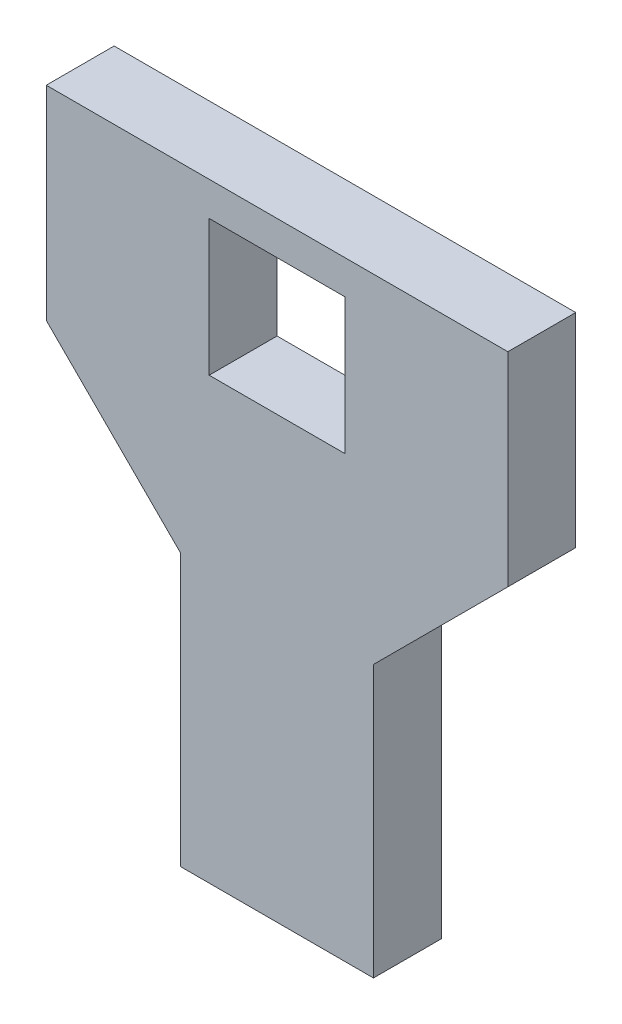
ISO-10303-21;
HEADER;
FILE_DESCRIPTION(('STEP AP214'),'2;1');
FILE_NAME('part.step','',(''),(''),'','','');
FILE_SCHEMA(('AUTOMOTIVE_DESIGN { 1 0 10303 214 1 1 1 1 }'));
ENDSEC;
DATA;
#1=APPLICATION_CONTEXT('core data for automotive mechanical design processes');
#2=APPLICATION_PROTOCOL_DEFINITION('international standard','automotive_design',2000,#1);
#3=PRODUCT_CONTEXT('',#1,'mechanical');
#4=PRODUCT('Part','Part','',(#3));
#5=PRODUCT_RELATED_PRODUCT_CATEGORY('part','',(#4));
#6=PRODUCT_DEFINITION_FORMATION('','',#4);
#7=PRODUCT_DEFINITION_CONTEXT('part definition',#1,'design');
#8=PRODUCT_DEFINITION('design','',#6,#7);
#9=PRODUCT_DEFINITION_SHAPE('','',#8);
#10=(LENGTH_UNIT() NAMED_UNIT(*) SI_UNIT(.MILLI.,.METRE.));
#11=(NAMED_UNIT(*) PLANE_ANGLE_UNIT() SI_UNIT($,.RADIAN.));
#12=(NAMED_UNIT(*) SI_UNIT($,.STERADIAN.) SOLID_ANGLE_UNIT());
#13=UNCERTAINTY_MEASURE_WITH_UNIT(LENGTH_MEASURE(1.E-05),#10,'distance_accuracy_value','');
#14=(GEOMETRIC_REPRESENTATION_CONTEXT(3) GLOBAL_UNCERTAINTY_ASSIGNED_CONTEXT((#13)) GLOBAL_UNIT_ASSIGNED_CONTEXT((#10,
#11,#12)) REPRESENTATION_CONTEXT('',''));
#15=CARTESIAN_POINT('',(0.,0.,0.));
#16=DIRECTION('',(0.,0.,1.));
#17=DIRECTION('',(1.,0.,0.));
#18=AXIS2_PLACEMENT_3D('',#15,#16,#17);
#19=CARTESIAN_POINT('',(0.,5.,5.));
#20=DIRECTION('',(0.,1.,0.));
#21=DIRECTION('',(-1.,0.,0.));
#22=AXIS2_PLACEMENT_3D('',#19,#20,#21);
#23=PLANE('',#22);
#24=DIRECTION('',(1.,0.,0.));
#25=VECTOR('',#24,1.);
#26=CARTESIAN_POINT('',(0.,5.,0.));
#27=LINE('',#26,#25);
#28=CARTESIAN_POINT('',(-5.,5.,0.));
#29=VERTEX_POINT('',#28);
#30=CARTESIAN_POINT('',(5.,5.,0.));
#31=VERTEX_POINT('',#30);
#32=EDGE_CURVE('E195',#29,#31,#27,.T.);
#33=ORIENTED_EDGE('',*,*,#32,.T.);
#34=DIRECTION('',(0.,0.,-1.));
#35=VECTOR('',#34,1.);
#36=CARTESIAN_POINT('',(5.,5.,5.));
#37=LINE('',#36,#35);
#38=CARTESIAN_POINT('',(5.,5.,5.));
#39=VERTEX_POINT('',#38);
#40=EDGE_CURVE('E11',#39,#31,#37,.T.);
#41=ORIENTED_EDGE('',*,*,#40,.F.);
#42=DIRECTION('',(1.,0.,0.));
#43=VECTOR('',#42,1.);
#44=CARTESIAN_POINT('',(0.,5.,5.));
#45=LINE('',#44,#43);
#46=CARTESIAN_POINT('',(-5.,5.,5.));
#47=VERTEX_POINT('',#46);
#48=EDGE_CURVE('E145',#47,#39,#45,.T.);
#49=ORIENTED_EDGE('',*,*,#48,.F.);
#50=DIRECTION('',(0.,0.,-1.));
#51=VECTOR('',#50,1.);
#52=CARTESIAN_POINT('',(-5.,5.,5.));
#53=LINE('',#52,#51);
#54=EDGE_CURVE('E61',#47,#29,#53,.T.);
#55=ORIENTED_EDGE('',*,*,#54,.T.);
#56=EDGE_LOOP('',(#33,#41,#49,#55));
#57=FACE_BOUND('',#56,.T.);
#58=ADVANCED_FACE('F41',(#57),#23,.F.);
#59=CARTESIAN_POINT('',(5.,0.,5.));
#60=DIRECTION('',(1.,0.,0.));
#61=DIRECTION('',(0.,1.,0.));
#62=AXIS2_PLACEMENT_3D('',#59,#60,#61);
#63=PLANE('',#62);
#64=DIRECTION('',(0.,-1.,0.));
#65=VECTOR('',#64,1.);
#66=CARTESIAN_POINT('',(5.,0.,0.));
#67=LINE('',#66,#65);
#68=CARTESIAN_POINT('',(5.,-5.,0.));
#69=VERTEX_POINT('',#68);
#70=EDGE_CURVE('E152',#31,#69,#67,.T.);
#71=ORIENTED_EDGE('',*,*,#70,.T.);
#72=DIRECTION('',(0.,0.,-1.));
#73=VECTOR('',#72,1.);
#74=CARTESIAN_POINT('',(5.,-5.,5.));
#75=LINE('',#74,#73);
#76=CARTESIAN_POINT('',(5.,-5.,5.));
#77=VERTEX_POINT('',#76);
#78=EDGE_CURVE('E52',#77,#69,#75,.T.);
#79=ORIENTED_EDGE('',*,*,#78,.F.);
#80=DIRECTION('',(0.,-1.,0.));
#81=VECTOR('',#80,1.);
#82=CARTESIAN_POINT('',(5.,0.,5.));
#83=LINE('',#82,#81);
#84=EDGE_CURVE('E139',#39,#77,#83,.T.);
#85=ORIENTED_EDGE('',*,*,#84,.F.);
#86=ORIENTED_EDGE('',*,*,#40,.T.);
#87=EDGE_LOOP('',(#71,#79,#85,#86));
#88=FACE_BOUND('',#87,.T.);
#89=ADVANCED_FACE('F151',(#88),#63,.F.);
#90=CARTESIAN_POINT('',(0.,-5.,5.));
#91=DIRECTION('',(0.,1.,0.));
#92=DIRECTION('',(0.,0.,1.));
#93=AXIS2_PLACEMENT_3D('',#90,#91,#92);
#94=PLANE('',#93);
#95=DIRECTION('',(1.,0.,0.));
#96=VECTOR('',#95,1.);
#97=CARTESIAN_POINT('',(0.,-5.,0.));
#98=LINE('',#97,#96);
#99=CARTESIAN_POINT('',(-5.,-5.,0.));
#100=VERTEX_POINT('',#99);
#101=EDGE_CURVE('E200',#100,#69,#98,.T.);
#102=ORIENTED_EDGE('',*,*,#101,.F.);
#103=DIRECTION('',(0.,0.,-1.));
#104=VECTOR('',#103,1.);
#105=CARTESIAN_POINT('',(-5.,-5.,5.));
#106=LINE('',#105,#104);
#107=CARTESIAN_POINT('',(-5.,-5.,5.));
#108=VERTEX_POINT('',#107);
#109=EDGE_CURVE('E99',#108,#100,#106,.T.);
#110=ORIENTED_EDGE('',*,*,#109,.F.);
#111=DIRECTION('',(1.,0.,0.));
#112=VECTOR('',#111,1.);
#113=CARTESIAN_POINT('',(0.,-5.,5.));
#114=LINE('',#113,#112);
#115=EDGE_CURVE('E144',#108,#77,#114,.T.);
#116=ORIENTED_EDGE('',*,*,#115,.T.);
#117=ORIENTED_EDGE('',*,*,#78,.T.);
#118=EDGE_LOOP('',(#102,#110,#116,#117));
#119=FACE_BOUND('',#118,.T.);
#120=ADVANCED_FACE('F157',(#119),#94,.T.);
#121=CARTESIAN_POINT('',(17.,0.,5.));
#122=DIRECTION('',(1.,0.,0.));
#123=DIRECTION('',(0.,0.,-1.));
#124=AXIS2_PLACEMENT_3D('',#121,#122,#123);
#125=PLANE('',#124);
#126=DIRECTION('',(0.,-1.,0.));
#127=VECTOR('',#126,1.);
#128=CARTESIAN_POINT('',(17.,0.,0.));
#129=LINE('',#128,#127);
#130=CARTESIAN_POINT('',(17.,7.5,0.));
#131=VERTEX_POINT('',#130);
#132=CARTESIAN_POINT('',(17.,-7.5,0.));
#133=VERTEX_POINT('',#132);
#134=EDGE_CURVE('E166',#131,#133,#129,.T.);
#135=ORIENTED_EDGE('',*,*,#134,.F.);
#136=DIRECTION('',(0.,0.,-1.));
#137=VECTOR('',#136,1.);
#138=CARTESIAN_POINT('',(17.,7.5,5.));
#139=LINE('',#138,#137);
#140=CARTESIAN_POINT('',(17.,7.5,5.));
#141=VERTEX_POINT('',#140);
#142=EDGE_CURVE('E45',#141,#131,#139,.T.);
#143=ORIENTED_EDGE('',*,*,#142,.F.);
#144=DIRECTION('',(0.,-1.,0.));
#145=VECTOR('',#144,1.);
#146=CARTESIAN_POINT('',(17.,0.,5.));
#147=LINE('',#146,#145);
#148=CARTESIAN_POINT('',(17.,-7.5,5.));
#149=VERTEX_POINT('',#148);
#150=EDGE_CURVE('E207',#141,#149,#147,.T.);
#151=ORIENTED_EDGE('',*,*,#150,.T.);
#152=DIRECTION('',(0.,0.,-1.));
#153=VECTOR('',#152,1.);
#154=CARTESIAN_POINT('',(17.,-7.5,5.));
#155=LINE('',#154,#153);
#156=EDGE_CURVE('E162',#149,#133,#155,.T.);
#157=ORIENTED_EDGE('',*,*,#156,.T.);
#158=EDGE_LOOP('',(#135,#143,#151,#157));
#159=FACE_BOUND('',#158,.T.);
#160=ADVANCED_FACE('F43',(#159),#125,.T.);
#161=CARTESIAN_POINT('',(0.,7.5,5.));
#162=DIRECTION('',(0.,1.,0.));
#163=DIRECTION('',(0.,0.,1.));
#164=AXIS2_PLACEMENT_3D('',#161,#162,#163);
#165=PLANE('',#164);
#166=DIRECTION('',(1.,0.,0.));
#167=VECTOR('',#166,1.);
#168=CARTESIAN_POINT('',(0.,7.5,0.));
#169=LINE('',#168,#167);
#170=CARTESIAN_POINT('',(-17.,7.5,0.));
#171=VERTEX_POINT('',#170);
#172=EDGE_CURVE('E170',#171,#131,#169,.T.);
#173=ORIENTED_EDGE('',*,*,#172,.F.);
#174=DIRECTION('',(0.,0.,-1.));
#175=VECTOR('',#174,1.);
#176=CARTESIAN_POINT('',(-17.,7.5,5.));
#177=LINE('',#176,#175);
#178=CARTESIAN_POINT('',(-17.,7.5,5.));
#179=VERTEX_POINT('',#178);
#180=EDGE_CURVE('E231',#179,#171,#177,.T.);
#181=ORIENTED_EDGE('',*,*,#180,.F.);
#182=DIRECTION('',(1.,0.,0.));
#183=VECTOR('',#182,1.);
#184=CARTESIAN_POINT('',(0.,7.5,5.));
#185=LINE('',#184,#183);
#186=EDGE_CURVE('E242',#179,#141,#185,.T.);
#187=ORIENTED_EDGE('',*,*,#186,.T.);
#188=ORIENTED_EDGE('',*,*,#142,.T.);
#189=EDGE_LOOP('',(#173,#181,#187,#188));
#190=FACE_BOUND('',#189,.T.);
#191=ADVANCED_FACE('F240',(#190),#165,.T.);
#192=CARTESIAN_POINT('',(-17.,0.,5.));
#193=DIRECTION('',(1.,0.,0.));
#194=DIRECTION('',(0.,0.,-1.));
#195=AXIS2_PLACEMENT_3D('',#192,#193,#194);
#196=PLANE('',#195);
#197=DIRECTION('',(0.,-1.,0.));
#198=VECTOR('',#197,1.);
#199=CARTESIAN_POINT('',(-17.,0.,0.));
#200=LINE('',#199,#198);
#201=CARTESIAN_POINT('',(-17.,-7.5,0.));
#202=VERTEX_POINT('',#201);
#203=EDGE_CURVE('E174',#171,#202,#200,.T.);
#204=ORIENTED_EDGE('',*,*,#203,.T.);
#205=DIRECTION('',(0.,0.,-1.));
#206=VECTOR('',#205,1.);
#207=CARTESIAN_POINT('',(-17.,-7.5,5.));
#208=LINE('',#207,#206);
#209=CARTESIAN_POINT('',(-17.,-7.5,5.));
#210=VERTEX_POINT('',#209);
#211=EDGE_CURVE('E228',#210,#202,#208,.T.);
#212=ORIENTED_EDGE('',*,*,#211,.F.);
#213=DIRECTION('',(0.,-1.,0.));
#214=VECTOR('',#213,1.);
#215=CARTESIAN_POINT('',(-17.,0.,5.));
#216=LINE('',#215,#214);
#217=EDGE_CURVE('E260',#179,#210,#216,.T.);
#218=ORIENTED_EDGE('',*,*,#217,.F.);
#219=ORIENTED_EDGE('',*,*,#180,.T.);
#220=EDGE_LOOP('',(#204,#212,#218,#219));
#221=FACE_BOUND('',#220,.T.);
#222=ADVANCED_FACE('F250',(#221),#196,.F.);
#223=CARTESIAN_POINT('',(-12.25,-12.25,5.));
#224=DIRECTION('',(0.707106781186548,0.707106781186547,0.));
#225=DIRECTION('',(-0.707106781186547,0.707106781186548,0.));
#226=AXIS2_PLACEMENT_3D('',#223,#224,#225);
#227=PLANE('',#226);
#228=DIRECTION('',(0.707106781186547,-0.707106781186548,0.));
#229=VECTOR('',#228,1.);
#230=CARTESIAN_POINT('',(-12.25,-12.25,0.));
#231=LINE('',#230,#229);
#232=CARTESIAN_POINT('',(-7.10050506338835,-17.3994949366117,0.));
#233=VERTEX_POINT('',#232);
#234=EDGE_CURVE('E177',#202,#233,#231,.T.);
#235=ORIENTED_EDGE('',*,*,#234,.T.);
#236=DIRECTION('',(0.,0.,-1.));
#237=VECTOR('',#236,1.);
#238=CARTESIAN_POINT('',(-7.10050506338835,-17.3994949366117,5.));
#239=LINE('',#238,#237);
#240=CARTESIAN_POINT('',(-7.10050506338835,-17.3994949366117,5.));
#241=VERTEX_POINT('',#240);
#242=EDGE_CURVE('E224',#241,#233,#239,.T.);
#243=ORIENTED_EDGE('',*,*,#242,.F.);
#244=DIRECTION('',(0.707106781186547,-0.707106781186548,0.));
#245=VECTOR('',#244,1.);
#246=CARTESIAN_POINT('',(-12.25,-12.25,5.));
#247=LINE('',#246,#245);
#248=EDGE_CURVE('E255',#210,#241,#247,.T.);
#249=ORIENTED_EDGE('',*,*,#248,.F.);
#250=ORIENTED_EDGE('',*,*,#211,.T.);
#251=EDGE_LOOP('',(#235,#243,#249,#250));
#252=FACE_BOUND('',#251,.T.);
#253=ADVANCED_FACE('F253',(#252),#227,.F.);
#254=CARTESIAN_POINT('',(-7.10050506338835,0.,5.));
#255=DIRECTION('',(1.,0.,0.));
#256=DIRECTION('',(0.,1.,0.));
#257=AXIS2_PLACEMENT_3D('',#254,#255,#256);
#258=PLANE('',#257);
#259=DIRECTION('',(0.,-1.,0.));
#260=VECTOR('',#259,1.);
#261=CARTESIAN_POINT('',(-7.10050506338835,0.,0.));
#262=LINE('',#261,#260);
#263=CARTESIAN_POINT('',(-7.10050506338835,-37.3994949366117,0.));
#264=VERTEX_POINT('',#263);
#265=EDGE_CURVE('E180',#233,#264,#262,.T.);
#266=ORIENTED_EDGE('',*,*,#265,.T.);
#267=DIRECTION('',(0.,0.,-1.));
#268=VECTOR('',#267,1.);
#269=CARTESIAN_POINT('',(-7.10050506338835,-37.3994949366117,5.));
#270=LINE('',#269,#268);
#271=CARTESIAN_POINT('',(-7.10050506338835,-37.3994949366117,5.));
#272=VERTEX_POINT('',#271);
#273=EDGE_CURVE('E220',#272,#264,#270,.T.);
#274=ORIENTED_EDGE('',*,*,#273,.F.);
#275=DIRECTION('',(0.,-1.,0.));
#276=VECTOR('',#275,1.);
#277=CARTESIAN_POINT('',(-7.10050506338835,0.,5.));
#278=LINE('',#277,#276);
#279=EDGE_CURVE('E259',#241,#272,#278,.T.);
#280=ORIENTED_EDGE('',*,*,#279,.F.);
#281=ORIENTED_EDGE('',*,*,#242,.T.);
#282=EDGE_LOOP('',(#266,#274,#280,#281));
#283=FACE_BOUND('',#282,.T.);
#284=ADVANCED_FACE('F293',(#283),#258,.F.);
#285=CARTESIAN_POINT('',(0.,-37.3994949366117,5.));
#286=DIRECTION('',(0.,1.,0.));
#287=DIRECTION('',(0.,0.,1.));
#288=AXIS2_PLACEMENT_3D('',#285,#286,#287);
#289=PLANE('',#288);
#290=DIRECTION('',(1.,0.,0.));
#291=VECTOR('',#290,1.);
#292=CARTESIAN_POINT('',(0.,-37.3994949366117,0.));
#293=LINE('',#292,#291);
#294=CARTESIAN_POINT('',(7.10050506338835,-37.3994949366117,0.));
#295=VERTEX_POINT('',#294);
#296=EDGE_CURVE('E183',#264,#295,#293,.T.);
#297=ORIENTED_EDGE('',*,*,#296,.T.);
#298=DIRECTION('',(0.,0.,-1.));
#299=VECTOR('',#298,1.);
#300=CARTESIAN_POINT('',(7.10050506338835,-37.3994949366117,5.));
#301=LINE('',#300,#299);
#302=CARTESIAN_POINT('',(7.10050506338835,-37.3994949366117,5.));
#303=VERTEX_POINT('',#302);
#304=EDGE_CURVE('E217',#303,#295,#301,.T.);
#305=ORIENTED_EDGE('',*,*,#304,.F.);
#306=DIRECTION('',(1.,0.,0.));
#307=VECTOR('',#306,1.);
#308=CARTESIAN_POINT('',(0.,-37.3994949366117,5.));
#309=LINE('',#308,#307);
#310=EDGE_CURVE('E264',#272,#303,#309,.T.);
#311=ORIENTED_EDGE('',*,*,#310,.F.);
#312=ORIENTED_EDGE('',*,*,#273,.T.);
#313=EDGE_LOOP('',(#297,#305,#311,#312));
#314=FACE_BOUND('',#313,.T.);
#315=ADVANCED_FACE('F290',(#314),#289,.F.);
#316=CARTESIAN_POINT('',(7.10050506338835,0.,5.));
#317=DIRECTION('',(1.,0.,0.));
#318=DIRECTION('',(0.,1.,0.));
#319=AXIS2_PLACEMENT_3D('',#316,#317,#318);
#320=PLANE('',#319);
#321=DIRECTION('',(0.,-1.,0.));
#322=VECTOR('',#321,1.);
#323=CARTESIAN_POINT('',(7.10050506338835,0.,0.));
#324=LINE('',#323,#322);
#325=CARTESIAN_POINT('',(7.10050506338835,-17.3994949366117,0.));
#326=VERTEX_POINT('',#325);
#327=EDGE_CURVE('E187',#326,#295,#324,.T.);
#328=ORIENTED_EDGE('',*,*,#327,.F.);
#329=DIRECTION('',(0.,0.,-1.));
#330=VECTOR('',#329,1.);
#331=CARTESIAN_POINT('',(7.10050506338835,-17.3994949366117,5.));
#332=LINE('',#331,#330);
#333=CARTESIAN_POINT('',(7.10050506338835,-17.3994949366117,5.));
#334=VERTEX_POINT('',#333);
#335=EDGE_CURVE('E214',#334,#326,#332,.T.);
#336=ORIENTED_EDGE('',*,*,#335,.F.);
#337=DIRECTION('',(0.,-1.,0.));
#338=VECTOR('',#337,1.);
#339=CARTESIAN_POINT('',(7.10050506338835,0.,5.));
#340=LINE('',#339,#338);
#341=EDGE_CURVE('E271',#334,#303,#340,.T.);
#342=ORIENTED_EDGE('',*,*,#341,.T.);
#343=ORIENTED_EDGE('',*,*,#304,.T.);
#344=EDGE_LOOP('',(#328,#336,#342,#343));
#345=FACE_BOUND('',#344,.T.);
#346=ADVANCED_FACE('F287',(#345),#320,.T.);
#347=CARTESIAN_POINT('',(12.25,-12.25,5.));
#348=DIRECTION('',(0.707106781186548,-0.707106781186547,0.));
#349=DIRECTION('',(0.707106781186547,0.707106781186548,0.));
#350=AXIS2_PLACEMENT_3D('',#347,#348,#349);
#351=PLANE('',#350);
#352=DIRECTION('',(-0.707106781186547,-0.707106781186548,0.));
#353=VECTOR('',#352,1.);
#354=CARTESIAN_POINT('',(12.25,-12.25,0.));
#355=LINE('',#354,#353);
#356=EDGE_CURVE('E191',#133,#326,#355,.T.);
#357=ORIENTED_EDGE('',*,*,#356,.F.);
#358=ORIENTED_EDGE('',*,*,#156,.F.);
#359=DIRECTION('',(-0.707106781186547,-0.707106781186548,0.));
#360=VECTOR('',#359,1.);
#361=CARTESIAN_POINT('',(12.25,-12.25,5.));
#362=LINE('',#361,#360);
#363=EDGE_CURVE('E275',#149,#334,#362,.T.);
#364=ORIENTED_EDGE('',*,*,#363,.T.);
#365=ORIENTED_EDGE('',*,*,#335,.T.);
#366=EDGE_LOOP('',(#357,#358,#364,#365));
#367=FACE_BOUND('',#366,.T.);
#368=ADVANCED_FACE('F281',(#367),#351,.T.);
#369=CARTESIAN_POINT('',(-5.,0.,5.));
#370=DIRECTION('',(1.,0.,0.));
#371=DIRECTION('',(0.,0.,-1.));
#372=AXIS2_PLACEMENT_3D('',#369,#370,#371);
#373=PLANE('',#372);
#374=DIRECTION('',(0.,-1.,0.));
#375=VECTOR('',#374,1.);
#376=CARTESIAN_POINT('',(-5.,0.,0.));
#377=LINE('',#376,#375);
#378=EDGE_CURVE('E203',#29,#100,#377,.T.);
#379=ORIENTED_EDGE('',*,*,#378,.F.);
#380=ORIENTED_EDGE('',*,*,#54,.F.);
#381=DIRECTION('',(0.,-1.,0.));
#382=VECTOR('',#381,1.);
#383=CARTESIAN_POINT('',(-5.,0.,5.));
#384=LINE('',#383,#382);
#385=EDGE_CURVE('E159',#47,#108,#384,.T.);
#386=ORIENTED_EDGE('',*,*,#385,.T.);
#387=ORIENTED_EDGE('',*,*,#109,.T.);
#388=EDGE_LOOP('',(#379,#380,#386,#387));
#389=FACE_BOUND('',#388,.T.);
#390=ADVANCED_FACE('F312',(#389),#373,.T.);
#391=CARTESIAN_POINT('',(0.,0.,5.));
#392=DIRECTION('',(0.,0.,1.));
#393=DIRECTION('',(1.,0.,0.));
#394=AXIS2_PLACEMENT_3D('',#391,#392,#393);
#395=PLANE('',#394);
#396=ORIENTED_EDGE('',*,*,#150,.F.);
#397=ORIENTED_EDGE('',*,*,#186,.F.);
#398=ORIENTED_EDGE('',*,*,#217,.T.);
#399=ORIENTED_EDGE('',*,*,#248,.T.);
#400=ORIENTED_EDGE('',*,*,#279,.T.);
#401=ORIENTED_EDGE('',*,*,#310,.T.);
#402=ORIENTED_EDGE('',*,*,#341,.F.);
#403=ORIENTED_EDGE('',*,*,#363,.F.);
#404=EDGE_LOOP('',(#396,#397,#398,#399,#400,#401,#402,#403));
#405=FACE_BOUND('',#404,.T.);
#406=ORIENTED_EDGE('',*,*,#48,.T.);
#407=ORIENTED_EDGE('',*,*,#84,.T.);
#408=ORIENTED_EDGE('',*,*,#115,.F.);
#409=ORIENTED_EDGE('',*,*,#385,.F.);
#410=EDGE_LOOP('',(#406,#407,#408,#409));
#411=FACE_BOUND('',#410,.T.);
#412=ADVANCED_FACE('F141',(#405,#411),#395,.T.);
#413=CARTESIAN_POINT('',(0.,0.,0.));
#414=DIRECTION('',(0.,0.,1.));
#415=DIRECTION('',(1.,0.,0.));
#416=AXIS2_PLACEMENT_3D('',#413,#414,#415);
#417=PLANE('',#416);
#418=ORIENTED_EDGE('',*,*,#134,.T.);
#419=ORIENTED_EDGE('',*,*,#356,.T.);
#420=ORIENTED_EDGE('',*,*,#327,.T.);
#421=ORIENTED_EDGE('',*,*,#296,.F.);
#422=ORIENTED_EDGE('',*,*,#265,.F.);
#423=ORIENTED_EDGE('',*,*,#234,.F.);
#424=ORIENTED_EDGE('',*,*,#203,.F.);
#425=ORIENTED_EDGE('',*,*,#172,.T.);
#426=EDGE_LOOP('',(#418,#419,#420,#421,#422,#423,#424,#425));
#427=FACE_BOUND('',#426,.T.);
#428=ORIENTED_EDGE('',*,*,#32,.F.);
#429=ORIENTED_EDGE('',*,*,#378,.T.);
#430=ORIENTED_EDGE('',*,*,#101,.T.);
#431=ORIENTED_EDGE('',*,*,#70,.F.);
#432=EDGE_LOOP('',(#428,#429,#430,#431));
#433=FACE_BOUND('',#432,.T.);
#434=ADVANCED_FACE('F245',(#427,#433),#417,.F.);
#435=CLOSED_SHELL('',(#58,#89,#120,#160,#191,#222,#253,#284,#315,#346,#368,#390,#412,#434));
#436=MANIFOLD_SOLID_BREP('B2',#435);
#437=ADVANCED_BREP_SHAPE_REPRESENTATION('',(#18,#436),#14);
#438=SHAPE_DEFINITION_REPRESENTATION(#9,#437);
ENDSEC;
END-ISO-10303-21;
